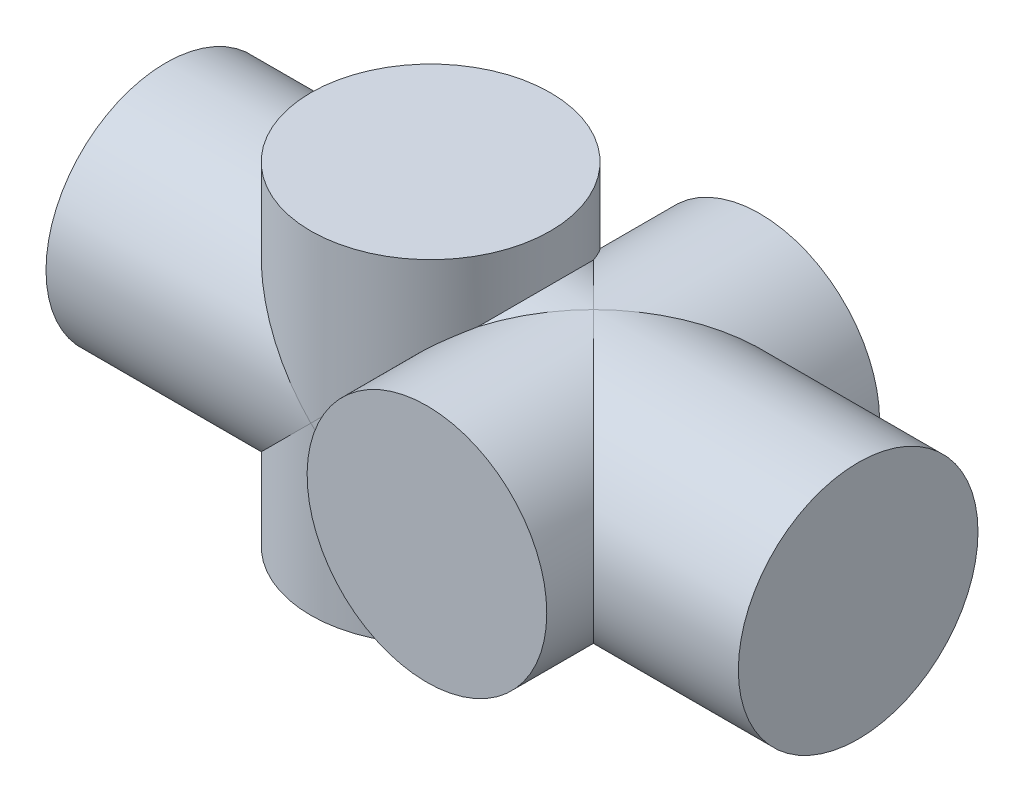
ISO-10303-21;
HEADER;
FILE_DESCRIPTION(('STEP AP214'),'2;1');
FILE_NAME('part.step','',(''),(''),'','','');
FILE_SCHEMA(('AUTOMOTIVE_DESIGN { 1 0 10303 214 1 1 1 1 }'));
ENDSEC;
DATA;
#1=APPLICATION_CONTEXT('core data for automotive mechanical design processes');
#2=APPLICATION_PROTOCOL_DEFINITION('international standard','automotive_design',2000,#1);
#3=PRODUCT_CONTEXT('',#1,'mechanical');
#4=PRODUCT('Part','Part','',(#3));
#5=PRODUCT_RELATED_PRODUCT_CATEGORY('part','',(#4));
#6=PRODUCT_DEFINITION_FORMATION('','',#4);
#7=PRODUCT_DEFINITION_CONTEXT('part definition',#1,'design');
#8=PRODUCT_DEFINITION('design','',#6,#7);
#9=PRODUCT_DEFINITION_SHAPE('','',#8);
#10=(LENGTH_UNIT() NAMED_UNIT(*) SI_UNIT(.MILLI.,.METRE.));
#11=(NAMED_UNIT(*) PLANE_ANGLE_UNIT() SI_UNIT($,.RADIAN.));
#12=(NAMED_UNIT(*) SI_UNIT($,.STERADIAN.) SOLID_ANGLE_UNIT());
#13=UNCERTAINTY_MEASURE_WITH_UNIT(LENGTH_MEASURE(1.E-05),#10,'distance_accuracy_value','');
#14=(GEOMETRIC_REPRESENTATION_CONTEXT(3) GLOBAL_UNCERTAINTY_ASSIGNED_CONTEXT((#13)) GLOBAL_UNIT_ASSIGNED_CONTEXT((#10,
#11,#12)) REPRESENTATION_CONTEXT('',''));
#15=CARTESIAN_POINT('',(0.,0.,0.));
#16=DIRECTION('',(0.,0.,1.));
#17=DIRECTION('',(1.,0.,0.));
#18=AXIS2_PLACEMENT_3D('',#15,#16,#17);
#19=CARTESIAN_POINT('',(-131.5,112.5,0.));
#20=DIRECTION('',(0.,-1.,0.));
#21=DIRECTION('',(0.,0.,-1.));
#22=AXIS2_PLACEMENT_3D('',#19,#20,#21);
#23=CYLINDRICAL_SURFACE('',#22,81.);
#24=CARTESIAN_POINT('',(-131.5,112.5,0.));
#25=DIRECTION('',(0.,1.,0.));
#26=DIRECTION('',(0.,0.,1.));
#27=AXIS2_PLACEMENT_3D('',#24,#25,#26);
#28=CIRCLE('',#27,81.);
#29=CARTESIAN_POINT('',(-131.5,112.5,81.));
#30=VERTEX_POINT('',#29);
#31=EDGE_CURVE('E175',#30,#30,#28,.T.);
#32=ORIENTED_EDGE('',*,*,#31,.F.);
#33=EDGE_LOOP('',(#32));
#34=FACE_BOUND('',#33,.T.);
#35=CARTESIAN_POINT('',(-131.5,0.,0.));
#36=DIRECTION('',(0.707106781186547,-0.707106781186547,0.));
#37=DIRECTION('',(-0.707106781186547,-0.707106781186547,0.));
#38=AXIS2_PLACEMENT_3D('',#35,#36,#37);
#39=ELLIPSE('',#38,114.551298552221,81.);
#40=CARTESIAN_POINT('',(-92.4843673631457,39.0156326368543,-70.9843673631458));
#41=VERTEX_POINT('',#40);
#42=CARTESIAN_POINT('',(-131.5,0.,-81.));
#43=VERTEX_POINT('',#42);
#44=EDGE_CURVE('E191',#41,#43,#39,.F.);
#45=ORIENTED_EDGE('',*,*,#44,.T.);
#46=CARTESIAN_POINT('',(-131.5,0.,0.));
#47=DIRECTION('',(-0.707106781186547,-0.707106781186547,0.));
#48=DIRECTION('',(0.707106781186547,-0.707106781186547,0.));
#49=AXIS2_PLACEMENT_3D('',#46,#47,#48);
#50=ELLIPSE('',#49,114.551298552221,81.);
#51=CARTESIAN_POINT('',(-131.5,0.,81.));
#52=VERTEX_POINT('',#51);
#53=EDGE_CURVE('E185',#43,#52,#50,.F.);
#54=ORIENTED_EDGE('',*,*,#53,.T.);
#55=CARTESIAN_POINT('',(-92.4843673631456,39.0156326368544,70.9843673631457));
#56=VERTEX_POINT('',#55);
#57=EDGE_CURVE('E63',#52,#56,#39,.F.);
#58=ORIENTED_EDGE('',*,*,#57,.T.);
#59=CARTESIAN_POINT('',(-102.5,0.,75.6306816047561));
#60=CARTESIAN_POINT('',(-102.499999696785,-1.02651249092197,75.6306818980094));
#61=CARTESIAN_POINT('',(-102.480482468346,-2.05303603876462,75.6232065312669));
#62=CARTESIAN_POINT('',(-102.402456997545,-4.10439117424408,75.5932187500969));
#63=CARTESIAN_POINT('',(-102.343948140469,-5.12922273495084,75.5707060986021));
#64=CARTESIAN_POINT('',(-102.188069727472,-7.17554071316511,75.5103816173126));
#65=CARTESIAN_POINT('',(-102.090697788913,-8.197026921702,75.4725688494882));
#66=CARTESIAN_POINT('',(-101.857322606304,-10.2348674698346,75.3812136843162));
#67=CARTESIAN_POINT('',(-101.721319519436,-11.2512218302937,75.3276713509688));
#68=CARTESIAN_POINT('',(-101.410952551921,-13.2774438774182,75.2042360728879));
#69=CARTESIAN_POINT('',(-101.236574594541,-14.2873090434369,75.134337127598));
#70=CARTESIAN_POINT('',(-100.849920620821,-16.2984235796766,74.9774376765525));
#71=CARTESIAN_POINT('',(-100.637644566289,-17.2996729412136,74.8904371535622));
#72=CARTESIAN_POINT('',(-100.17574668281,-19.2917678948949,74.6984183540577));
#73=CARTESIAN_POINT('',(-99.9261252935789,-20.2826136093879,74.5934002896854));
#74=CARTESIAN_POINT('',(-99.3902113681338,-22.2521121175052,74.3642817002539));
#75=CARTESIAN_POINT('',(-99.1039188274995,-23.2307649096597,74.2401811728946));
#76=CARTESIAN_POINT('',(-98.4946198723409,-25.1767948310647,73.971319260287));
#77=CARTESIAN_POINT('',(-98.1715120245247,-26.1441322956402,73.8265004977237));
#78=CARTESIAN_POINT('',(-97.4902208033794,-28.0628352452722,73.5151357571378));
#79=CARTESIAN_POINT('',(-97.1320374058587,-29.0142007193123,73.3485897641298));
#80=CARTESIAN_POINT('',(-96.3817434135551,-30.8990848144741,72.9923318678649));
#81=CARTESIAN_POINT('',(-95.9896319902784,-31.8326029991001,72.8026193988555));
#82=CARTESIAN_POINT('',(-95.1728416227614,-33.6798493505506,72.3985162806009));
#83=CARTESIAN_POINT('',(-94.7481627251849,-34.5935775457286,72.1841256667151));
#84=CARTESIAN_POINT('',(-93.8680597872073,-36.3987864210386,71.7292289838563));
#85=CARTESIAN_POINT('',(-93.4126539154994,-37.2902798286505,71.4887382973988));
#86=CARTESIAN_POINT('',(-92.4726661885438,-39.0496527018732,70.9799464882254));
#87=CARTESIAN_POINT('',(-91.9880842532381,-39.9175321026784,70.7116452891971));
#88=CARTESIAN_POINT('',(-90.9918122721425,-41.6277226258935,70.1456691815644));
#89=CARTESIAN_POINT('',(-90.4801237071992,-42.4700351410868,69.8479958768058));
#90=CARTESIAN_POINT('',(-89.431913558972,-44.1272745840299,69.2217364474735));
#91=CARTESIAN_POINT('',(-88.8953923069081,-44.9422018767954,68.8931507351514));
#92=CARTESIAN_POINT('',(-87.8276506996059,-46.5025910136248,68.2209906080732));
#93=CARTESIAN_POINT('',(-87.2975230513287,-47.2494846420378,67.8790033467085));
#94=CARTESIAN_POINT('',(-86.2195919425869,-48.7155230100524,67.1647424951134));
#95=CARTESIAN_POINT('',(-85.6717886693281,-49.4346680433675,66.792469225584));
#96=CARTESIAN_POINT('',(-84.5611269957467,-50.8438698967652,66.0166722692669));
#97=CARTESIAN_POINT('',(-83.9982689081717,-51.5339273203461,65.6131492313301));
#98=CARTESIAN_POINT('',(-82.8602837591952,-52.8837863643804,64.7740514625634));
#99=CARTESIAN_POINT('',(-82.2851566908547,-53.5435879677213,64.3384767136053));
#100=CARTESIAN_POINT('',(-81.1259769238645,-54.8314963548812,63.4349856812652));
#101=CARTESIAN_POINT('',(-80.5419303798208,-55.4596238117663,62.9670909777734));
#102=CARTESIAN_POINT('',(-79.3676183867358,-56.6838441531627,61.9983397000222));
#103=CARTESIAN_POINT('',(-78.7773529091204,-57.2799368904072,61.4974829742567));
#104=CARTESIAN_POINT('',(-77.593815661564,-58.4394570628812,60.4627249134944));
#105=CARTESIAN_POINT('',(-77.0005440898342,-59.0028866220958,59.9288257318243));
#106=CARTESIAN_POINT('',(-75.8141767781288,-60.0967652694794,58.828086751621));
#107=CARTESIAN_POINT('',(-75.2210810345763,-60.6272150819827,58.261247677076));
#108=CARTESIAN_POINT('',(-74.0952438342061,-61.6055331570985,57.1511796992874));
#109=CARTESIAN_POINT('',(-73.5621910198054,-62.0564345871083,56.6109347382194));
#110=CARTESIAN_POINT('',(-72.5011765337514,-62.9313338885521,55.5042916678667));
#111=CARTESIAN_POINT('',(-71.9732148460277,-63.3553318449312,54.9378936411676));
#112=CARTESIAN_POINT('',(-70.924703410765,-64.1766481764497,53.7795840751253));
#113=CARTESIAN_POINT('',(-70.4041530865649,-64.5739686363418,53.1876745353664));
#114=CARTESIAN_POINT('',(-69.3726104205713,-65.3423815474801,51.9790216579819));
#115=CARTESIAN_POINT('',(-68.861618134206,-65.7134738466607,51.3622781764063));
#116=CARTESIAN_POINT('',(-67.8511942517921,-66.4300420545227,50.1046930239155));
#117=CARTESIAN_POINT('',(-67.3517647326984,-66.7755133852345,49.4638470770408));
#118=CARTESIAN_POINT('',(-66.3664880179111,-67.4414699584751,48.1590489471537));
#119=CARTESIAN_POINT('',(-65.8806420203021,-67.7619530014354,47.4950947374835));
#120=CARTESIAN_POINT('',(-64.9244472923161,-68.3786592020229,46.1452042174617));
#121=CARTESIAN_POINT('',(-64.4540976124037,-68.67488384774,45.4592692590783));
#122=CARTESIAN_POINT('',(-63.5305227745717,-69.2439846862287,44.0664101181739));
#123=CARTESIAN_POINT('',(-63.0772991967075,-69.5168587275945,43.3594840097003));
#124=CARTESIAN_POINT('',(-62.1856073238472,-70.0424986524759,41.9194297780638));
#125=CARTESIAN_POINT('',(-61.7473074160848,-70.2950626848286,41.1861237597273));
#126=CARTESIAN_POINT('',(-60.8911902591343,-70.7783568102733,39.7005170726045));
#127=CARTESIAN_POINT('',(-60.4733748596574,-71.0090849333689,38.9482146977426));
#128=CARTESIAN_POINT('',(-59.6596203680497,-71.4496847066751,37.4259887180687));
#129=CARTESIAN_POINT('',(-59.2636791140451,-71.6595584196199,36.6560668653066));
#130=CARTESIAN_POINT('',(-58.4947707002254,-72.0595223642898,35.0997140840543));
#131=CARTESIAN_POINT('',(-58.1218053769475,-72.249611015369,34.3132818425568));
#132=CARTESIAN_POINT('',(-57.3998617995223,-72.6110385412077,32.7250754435455));
#133=CARTESIAN_POINT('',(-57.0508878118345,-72.7823740842304,31.9232985894902));
#134=CARTESIAN_POINT('',(-56.3778889339796,-73.1072671042087,30.3057073020996));
#135=CARTESIAN_POINT('',(-56.0538663996355,-73.2608229031549,29.4898915521394));
#136=CARTESIAN_POINT('',(-55.4316161974454,-73.5510930759802,27.845533938232));
#137=CARTESIAN_POINT('',(-55.1333884100315,-73.6878075279263,27.0169921332957));
#138=CARTESIAN_POINT('',(-54.5634278986493,-73.9453008667947,25.3483959594753));
#139=CARTESIAN_POINT('',(-54.2916955150644,-74.0660795489989,24.508341442847));
#140=CARTESIAN_POINT('',(-53.7498192252839,-74.3037359301135,22.7343877979392));
#141=CARTESIAN_POINT('',(-53.4824862457982,-74.4190484917617,21.7994189032543));
#142=CARTESIAN_POINT('',(-52.981238489759,-74.6324716034373,19.9186170804299));
#143=CARTESIAN_POINT('',(-52.7473242441951,-74.7305818801435,18.9727839799272));
#144=CARTESIAN_POINT('',(-52.3134808318338,-74.9105103150816,17.0717815851057));
#145=CARTESIAN_POINT('',(-52.113553022316,-74.9923278226689,16.1166119195328));
#146=CARTESIAN_POINT('',(-51.7481626498739,-75.1404519605577,14.1985074304101));
#147=CARTESIAN_POINT('',(-51.5827002695041,-75.2067585087018,13.2355725657581));
#148=CARTESIAN_POINT('',(-51.2865648993686,-75.324537533496,11.3031267184256));
#149=CARTESIAN_POINT('',(-51.1559039474496,-75.3760048777582,10.3336135789197));
#150=CARTESIAN_POINT('',(-50.9297337071062,-75.4645978224251,8.38984739813074));
#151=CARTESIAN_POINT('',(-50.8342243532452,-75.5017234495277,7.41559436567462));
#152=CARTESIAN_POINT('',(-50.6785596768277,-75.5620184114897,5.46381083343742));
#153=CARTESIAN_POINT('',(-50.6184053143102,-75.5851873673662,4.48628024538152));
#154=CARTESIAN_POINT('',(-50.5335812484305,-75.6178101518882,2.52945538339216));
#155=CARTESIAN_POINT('',(-50.5089116026213,-75.627263958289,1.55016110660073));
#156=CARTESIAN_POINT('',(-50.4946132896076,-75.6327476354153,-0.479175573740624));
#157=CARTESIAN_POINT('',(-50.5076325292551,-75.6277630971369,-1.52924051230695));
#158=CARTESIAN_POINT('',(-50.5744746053025,-75.6020912002519,-3.62788756597481));
#159=CARTESIAN_POINT('',(-50.6282979464475,-75.5814036473995,-4.6764696625729));
#160=CARTESIAN_POINT('',(-50.7766222726352,-75.5240737325437,-6.77037228625007));
#161=CARTESIAN_POINT('',(-50.871125347105,-75.4874305510126,-7.81569264301868));
#162=CARTESIAN_POINT('',(-51.1005773452327,-75.3977518943373,-9.90117689409717));
#163=CARTESIAN_POINT('',(-51.235526140797,-75.3447164711081,-10.9413408047272));
#164=CARTESIAN_POINT('',(-51.5455779864131,-75.2216130628653,-13.0149820642302));
#165=CARTESIAN_POINT('',(-51.7206933066151,-75.1515398727271,-14.0484572704255));
#166=CARTESIAN_POINT('',(-52.1106008803789,-74.9935687640029,-16.1065272232333));
#167=CARTESIAN_POINT('',(-52.3253931626947,-74.9056708324994,-17.1311219634095));
#168=CARTESIAN_POINT('',(-52.7940724566501,-74.7110795372037,-19.169523536128));
#169=CARTESIAN_POINT('',(-53.0479591137398,-74.6043863438659,-20.1833304664167));
#170=CARTESIAN_POINT('',(-53.5941102980155,-74.3710713697773,-22.1982403180846));
#171=CARTESIAN_POINT('',(-53.8863748372953,-74.2444495827465,-23.1993432354604));
#172=CARTESIAN_POINT('',(-54.5095003985977,-73.9695156955307,-25.1903728114787));
#173=CARTESIAN_POINT('',(-54.8404930831391,-73.8211291421029,-26.1802480125368));
#174=CARTESIAN_POINT('',(-55.5391945241107,-73.5015700523862,-28.1432298321242));
#175=CARTESIAN_POINT('',(-55.9069033145582,-73.330397494986,-29.1163364351165));
#176=CARTESIAN_POINT('',(-56.6778016365654,-72.9637200797935,-31.0437750622005));
#177=CARTESIAN_POINT('',(-57.0809922489638,-72.7682144806985,-31.9981065132838));
#178=CARTESIAN_POINT('',(-57.9213829155271,-72.3512465528694,-33.8859055309752));
#179=CARTESIAN_POINT('',(-58.3585829022303,-72.1297842756231,-34.8193731389646));
#180=CARTESIAN_POINT('',(-59.264974704593,-71.6593830850097,-36.6627225050849));
#181=CARTESIAN_POINT('',(-59.7341435741344,-71.4104638015161,-37.5726205464759));
#182=CARTESIAN_POINT('',(-60.7028049768336,-70.8833132905135,-39.3674623852477));
#183=CARTESIAN_POINT('',(-61.202297641984,-70.6050819354119,-40.2524060739834));
#184=CARTESIAN_POINT('',(-62.2293435627601,-70.0176441550678,-41.9952274676966));
#185=CARTESIAN_POINT('',(-62.7568945634566,-69.7084402172013,-42.8531073388769));
#186=CARTESIAN_POINT('',(-63.8375868786749,-69.0574153540745,-44.5398815501744));
#187=CARTESIAN_POINT('',(-64.3907276811128,-68.7155950813626,-45.3687764697345));
#188=CARTESIAN_POINT('',(-65.4786264481031,-68.0240030529499,-46.9363497771932));
#189=CARTESIAN_POINT('',(-66.0117829563977,-67.6766293413444,-47.6771989037167));
#190=CARTESIAN_POINT('',(-67.0952456178144,-66.9514635721666,-49.130941116537));
#191=CARTESIAN_POINT('',(-67.6455515022954,-66.5736719909368,-49.8438346403577));
#192=CARTESIAN_POINT('',(-68.7606562790235,-65.7867463691742,-51.2403469695462));
#193=CARTESIAN_POINT('',(-69.325454643915,-65.3776134680234,-51.9239668377211));
#194=CARTESIAN_POINT('',(-70.466744015904,-64.5272373982978,-53.2608119514133));
#195=CARTESIAN_POINT('',(-71.0432350451923,-64.0859941687785,-53.9140371392385));
#196=CARTESIAN_POINT('',(-72.2045366909791,-63.1711638311871,-55.1886843033277));
#197=CARTESIAN_POINT('',(-72.7893413818674,-62.6975989272128,-55.81012760957));
#198=CARTESIAN_POINT('',(-73.9645660389313,-61.7175396006933,-57.0209229043239));
#199=CARTESIAN_POINT('',(-74.554986029058,-61.2110450376382,-57.6102747558822));
#200=CARTESIAN_POINT('',(-75.7382307819224,-60.1650878153904,-58.7563055976803));
#201=CARTESIAN_POINT('',(-76.3310553984062,-59.6256271339986,-59.3129865440891));
#202=CARTESIAN_POINT('',(-77.5159319901644,-58.5138894846307,-60.3934035854787));
#203=CARTESIAN_POINT('',(-78.1079839819951,-57.9416132320639,-60.9171403981501));
#204=CARTESIAN_POINT('',(-79.2311289926648,-56.8215067421121,-61.8826258125064));
#205=CARTESIAN_POINT('',(-79.7625875110947,-56.2766526196632,-62.3274077798435));
#206=CARTESIAN_POINT('',(-80.8199611243584,-55.1609723388467,-63.1901832422744));
#207=CARTESIAN_POINT('',(-81.3458762351517,-54.5901462552779,-63.6081768145099));
#208=CARTESIAN_POINT('',(-82.3898657231055,-53.4231890965572,-64.4176294732548));
#209=CARTESIAN_POINT('',(-82.9079407251466,-52.827060052692,-64.8090906832185));
#210=CARTESIAN_POINT('',(-83.9341332540467,-51.6101972481972,-65.5659577861062));
#211=CARTESIAN_POINT('',(-84.4422507226088,-50.9894633435813,-65.9313635265201));
#212=CARTESIAN_POINT('',(-85.4465635155765,-49.7241346521809,-66.6367589088936));
#213=CARTESIAN_POINT('',(-85.94275652431,-49.0795352916104,-66.9767436408531));
#214=CARTESIAN_POINT('',(-86.9212242857218,-47.7674909310755,-67.6319412371838));
#215=CARTESIAN_POINT('',(-87.4034978199064,-47.1000439421701,-67.947151937003));
#216=CARTESIAN_POINT('',(-88.3522480184002,-45.7434369648334,-68.5535444571402));
#217=CARTESIAN_POINT('',(-88.8187256146303,-45.0542782619858,-68.8447276964797));
#218=CARTESIAN_POINT('',(-89.7342892878138,-43.6552485706271,-69.4039855269763));
#219=CARTESIAN_POINT('',(-90.183373762978,-42.945375684985,-69.6720579925608));
#220=CARTESIAN_POINT('',(-91.0679280894477,-41.4973720262203,-70.1891245776664));
#221=CARTESIAN_POINT('',(-91.5031659811448,-40.7590026022327,-70.4378470640957));
#222=CARTESIAN_POINT('',(-92.3528185099446,-39.2634419559046,-70.9135760243567));
#223=CARTESIAN_POINT('',(-92.7672312634053,-38.5062490401971,-71.1405805354611));
#224=CARTESIAN_POINT('',(-93.5738658972557,-36.9744098387789,-71.5738637776939));
#225=CARTESIAN_POINT('',(-93.9660899268166,-36.1997652536118,-71.7801445176069));
#226=CARTESIAN_POINT('',(-94.7272522334155,-34.6341958825581,-72.1730444038818));
#227=CARTESIAN_POINT('',(-95.0961886518569,-33.8432698039004,-72.3596619817097));
#228=CARTESIAN_POINT('',(-96.1666029867914,-31.4476768070967,-72.8916129316503));
#229=CARTESIAN_POINT('',(-96.8316490809798,-29.8202650587775,-73.2090249901574));
#230=CARTESIAN_POINT('',(-98.0574682065155,-26.5153014130878,-73.7770548139781));
#231=CARTESIAN_POINT('',(-98.6182353913028,-24.8377467104911,-74.0276688344964));
#232=CARTESIAN_POINT('',(-99.4024946700563,-22.2069948235853,-74.3696274356743));
#233=CARTESIAN_POINT('',(-99.6641754962411,-21.2676809106178,-74.4818821639001));
#234=CARTESIAN_POINT('',(-100.153862826066,-19.3783872477454,-74.6892937333409));
#235=CARTESIAN_POINT('',(-100.381868791266,-18.4284073275591,-74.7844503011723));
#236=CARTESIAN_POINT('',(-100.803630907512,-16.5193777962654,-74.9585547193236));
#237=CARTESIAN_POINT('',(-100.997385663887,-15.5603278175102,-75.0375019096375));
#238=CARTESIAN_POINT('',(-101.350187728071,-13.6347206341405,-75.17995095972));
#239=CARTESIAN_POINT('',(-101.509234855765,-12.6681633905945,-75.2434527393359));
#240=CARTESIAN_POINT('',(-101.792308931756,-10.7287393844217,-75.3556652057852));
#241=CARTESIAN_POINT('',(-101.916323691543,-9.75587054598836,-75.4043707451341));
#242=CARTESIAN_POINT('',(-102.12898765238,-7.80566965237183,-75.4874603308562));
#243=CARTESIAN_POINT('',(-102.217636917291,-6.82833760525132,-75.5218444030903));
#244=CARTESIAN_POINT('',(-102.359381664808,-4.87068227338653,-75.5766507656101));
#245=CARTESIAN_POINT('',(-102.412476205117,-3.89035891005575,-75.5970726858604));
#246=CARTESIAN_POINT('',(-102.48299582985,-1.92824354887082,-75.6241686460428));
#247=CARTESIAN_POINT('',(-102.500420865035,-0.946451548991167,-75.6308426669966));
#248=CARTESIAN_POINT('',(-102.499533556418,1.08622263504153,-75.6305030879559));
#249=CARTESIAN_POINT('',(-102.478619918249,2.13710462069567,-75.6224931766545));
#250=CARTESIAN_POINT('',(-102.395931539903,4.2370298478073,-75.5907080718105));
#251=CARTESIAN_POINT('',(-102.334156303681,5.2860730667878,-75.5669326868803));
#252=CARTESIAN_POINT('',(-102.169890183302,7.38053533218638,-75.5033272010964));
#253=CARTESIAN_POINT('',(-102.067397218326,8.42595419063238,-75.4634962797471));
#254=CARTESIAN_POINT('',(-101.821948949311,10.5112655036641,-75.367304962939));
#255=CARTESIAN_POINT('',(-101.678993771985,11.5511579755461,-75.3109446192446));
#256=CARTESIAN_POINT('',(-101.352934580101,13.6238675061482,-75.1810165708209));
#257=CARTESIAN_POINT('',(-101.169818685892,14.6566823778758,-75.1074437741698));
#258=CARTESIAN_POINT('',(-100.763942064675,16.7130433729394,-74.9422627364769));
#259=CARTESIAN_POINT('',(-100.541181306029,17.736589488878,-74.8506544810425));
#260=CARTESIAN_POINT('',(-100.0566253585,19.77249387148,-74.6483965759783));
#261=CARTESIAN_POINT('',(-99.7948305647981,20.7848522512971,-74.5377471191206));
#262=CARTESIAN_POINT('',(-99.2329543689103,22.7964548502618,-74.2962399252116));
#263=CARTESIAN_POINT('',(-98.9328729686562,23.795699070071,-74.16538218918));
#264=CARTESIAN_POINT('',(-98.2947686748046,25.7808534159222,-73.8818970042251));
#265=CARTESIAN_POINT('',(-97.9566798979775,26.7667369623738,-73.7292316253083));
#266=CARTESIAN_POINT('',(-97.2440782298514,28.7213628907844,-73.4008563973646));
#267=CARTESIAN_POINT('',(-96.8695653169099,29.6901052625581,-73.2251465346452));
#268=CARTESIAN_POINT('',(-96.0853882472949,31.6084420413309,-72.8491204323139));
#269=CARTESIAN_POINT('',(-95.6757230561797,32.5580358838214,-72.6488034685029));
#270=CARTESIAN_POINT('',(-94.8227534576231,34.4359894177473,-72.2219288834181));
#271=CARTESIAN_POINT('',(-94.3794491159714,35.3643491507068,-71.9953713134639));
#272=CARTESIAN_POINT('',(-93.4612806817627,37.1970937254172,-71.5145032695896));
#273=CARTESIAN_POINT('',(-92.9864401796782,38.1014957956601,-71.2602134512171));
#274=CARTESIAN_POINT('',(-92.0068977151345,39.8849901713924,-70.7220413104566));
#275=CARTESIAN_POINT('',(-91.5021956201366,40.7640823645197,-70.4381588567193));
#276=CARTESIAN_POINT('',(-90.465243054001,42.4948570255399,-69.839152227353));
#277=CARTESIAN_POINT('',(-89.9329948488405,43.3465417386882,-69.5240306195495));
#278=CARTESIAN_POINT('',(-88.843468298905,45.020601788144,-68.8609246324734));
#279=CARTESIAN_POINT('',(-88.2861904681718,45.842977725754,-68.5129409279389));
#280=CARTESIAN_POINT('',(-87.1919372176499,47.396236728678,-67.8099273692019));
#281=CARTESIAN_POINT('',(-86.6565577749914,48.1293639302149,-67.4573683681797));
#282=CARTESIAN_POINT('',(-85.5692678462494,49.5675448873633,-66.7218001560649));
#283=CARTESIAN_POINT('',(-85.0173576262145,50.2725990943604,-66.3387914348702));
#284=CARTESIAN_POINT('',(-83.8996795137978,51.6533532334829,-65.5414424898126));
#285=CARTESIAN_POINT('',(-83.3339121483013,52.3290542789915,-65.1271034559643));
#286=CARTESIAN_POINT('',(-82.1913282563703,53.6500260330118,-64.2663710388339));
#287=CARTESIAN_POINT('',(-81.6145117070713,54.2952966785434,-63.8199775892153));
#288=CARTESIAN_POINT('',(-80.4531861986835,55.5540697998994,-62.8949402153935));
#289=CARTESIAN_POINT('',(-79.8686824799678,56.1675926399574,-62.4163174293849));
#290=CARTESIAN_POINT('',(-78.6946963552961,57.3626036611956,-61.426293006988));
#291=CARTESIAN_POINT('',(-78.1052139286658,57.9440917092744,-60.9148912344253));
#292=CARTESIAN_POINT('',(-76.9244628947235,59.0745030132976,-59.8593167453503));
#293=CARTESIAN_POINT('',(-76.3331943916232,59.6234281320343,-59.3151459070181));
#294=CARTESIAN_POINT('',(-75.1520246957716,60.6884883166824,-58.1942309018935));
#295=CARTESIAN_POINT('',(-74.5621234741971,61.204624079989,-57.6174874283801));
#296=CARTESIAN_POINT('',(-73.4428646355552,62.1564632213881,-56.488400039848));
#297=CARTESIAN_POINT('',(-72.913095178843,62.5951440656717,-55.9389695915384));
#298=CARTESIAN_POINT('',(-71.8595468970373,63.4458386538378,-54.8143230831458));
#299=CARTESIAN_POINT('',(-71.3357680574142,63.8578524624102,-54.23910708562));
#300=CARTESIAN_POINT('',(-70.2964729209883,64.6554971935171,-53.0635819305947));
#301=CARTESIAN_POINT('',(-69.7809559672218,65.0411302218335,-52.4632747821123));
#302=CARTESIAN_POINT('',(-68.7602726649116,65.7865183524034,-51.2382885118003));
#303=CARTESIAN_POINT('',(-68.2551063764958,66.1462733043596,-50.6136092484524));
#304=CARTESIAN_POINT('',(-67.2570552205345,66.8405679870533,-49.340635580693));
#305=CARTESIAN_POINT('',(-66.7641728040923,67.1751027119318,-48.6923365257648));
#306=CARTESIAN_POINT('',(-65.7926548972935,67.8196179702969,-47.3731557213479));
#307=CARTESIAN_POINT('',(-65.3140206445484,68.1295963746563,-46.7022720208543));
#308=CARTESIAN_POINT('',(-64.3728415437748,68.7257576464565,-45.3390626436163));
#309=CARTESIAN_POINT('',(-63.91029577538,69.0119418763858,-44.6467381977201));
#310=CARTESIAN_POINT('',(-63.0028554561425,69.5614431959415,-43.2416546210936));
#311=CARTESIAN_POINT('',(-62.557962528029,69.8247581859565,-42.5288936220693));
#312=CARTESIAN_POINT('',(-61.680639258648,70.333329845653,-41.0729875480356));
#313=CARTESIAN_POINT('',(-61.2485075091918,70.5782448124676,-40.3295432254618));
#314=CARTESIAN_POINT('',(-60.4054061818847,71.0464771151741,-38.8240030322069));
#315=CARTESIAN_POINT('',(-59.9944385217723,71.2697924954703,-38.0619054805017));
#316=CARTESIAN_POINT('',(-59.1950113121272,71.6958248191477,-36.520436001577));
#317=CARTESIAN_POINT('',(-58.8065496307257,71.8985437148972,-35.74106572021));
#318=CARTESIAN_POINT('',(-58.0532107910826,72.2844503947217,-34.1662327262862));
#319=CARTESIAN_POINT('',(-57.6883355125977,72.4676366228629,-33.3707687377323));
#320=CARTESIAN_POINT('',(-56.6305238312536,72.9894914192132,-30.9618486433494));
#321=CARTESIAN_POINT('',(-55.9744399375698,73.3004359627141,-29.3259382129489));
#322=CARTESIAN_POINT('',(-54.7675220057391,73.8560337969666,-26.0047932769461));
#323=CARTESIAN_POINT('',(-54.2166938287432,74.1006833964098,-24.3195560306086));
#324=CARTESIAN_POINT('',(-53.4483625480634,74.4337936889798,-21.6770948539841));
#325=CARTESIAN_POINT('',(-53.192390979125,74.5430037119395,-20.7334531700606));
#326=CARTESIAN_POINT('',(-52.7143951304083,74.7444246314297,-18.8357539177124));
#327=CARTESIAN_POINT('',(-52.4923713964403,74.8366352546502,-17.8816961820835));
#328=CARTESIAN_POINT('',(-52.0828297095522,75.0049297692521,-15.9647673762634));
#329=CARTESIAN_POINT('',(-51.8953131878083,75.0810129917741,-15.0018959422645));
#330=CARTESIAN_POINT('',(-51.5552278914156,75.2177963289606,-13.0689102108796));
#331=CARTESIAN_POINT('',(-51.4026592943456,75.2784963654595,-12.0987958767165));
#332=CARTESIAN_POINT('',(-51.1327694348156,75.385144656641,-10.1525269377466));
#333=CARTESIAN_POINT('',(-51.0154604890263,75.4310877569108,-9.17637034353648));
#334=CARTESIAN_POINT('',(-50.816418674906,75.5086684176654,-7.21987392674413));
#335=CARTESIAN_POINT('',(-50.7346857443346,75.5403060031777,-6.23953411148349));
#336=CARTESIAN_POINT('',(-50.606969795115,75.5896090663361,-4.27615256484662));
#337=CARTESIAN_POINT('',(-50.5609877005137,75.6072741828379,-3.29311076429153));
#338=CARTESIAN_POINT('',(-50.5048740270738,75.6288184069722,-1.32585686617385));
#339=CARTESIAN_POINT('',(-50.4947424889231,75.6326974989585,-0.34164476728433));
#340=CARTESIAN_POINT('',(-50.5108896034806,75.6265060304354,1.69417792897779));
#341=CARTESIAN_POINT('',(-50.5397214920923,75.6154572736393,2.74576637027087));
#342=CARTESIAN_POINT('',(-50.6382968590086,75.5775259654606,4.84674673304194));
#343=CARTESIAN_POINT('',(-50.7080408243877,75.5506432255683,5.8961386282199));
#344=CARTESIAN_POINT('',(-50.8882751402461,75.4807169463865,7.99093377074715));
#345=CARTESIAN_POINT('',(-50.9987675621135,75.4376725855426,9.03633681259899));
#346=CARTESIAN_POINT('',(-51.2602236447093,75.3349110002995,11.1212446929245));
#347=CARTESIAN_POINT('',(-51.4111871801386,75.2751938275194,12.1607495496488));
#348=CARTESIAN_POINT('',(-51.7532493352979,75.1383713146628,14.2322920646973));
#349=CARTESIAN_POINT('',(-51.9443594011686,75.0612610151844,15.2643275064303));
#350=CARTESIAN_POINT('',(-52.366183669651,74.8887883624711,17.3187395610182));
#351=CARTESIAN_POINT('',(-52.5968979068043,74.7934259933173,18.341116165448));
#352=CARTESIAN_POINT('',(-53.0972912888002,74.5834083590601,20.3742798311924));
#353=CARTESIAN_POINT('',(-53.3669699968275,74.4687533102371,21.3850670222943));
#354=CARTESIAN_POINT('',(-53.9445128589945,74.2189501923916,23.3931154938268));
#355=CARTESIAN_POINT('',(-54.2523769969813,74.083802132038,24.3903767799789));
#356=CARTESIAN_POINT('',(-54.9053518352611,73.7916688418842,26.369406532659));
#357=CARTESIAN_POINT('',(-55.2504629417149,73.634683373952,27.3511748301093));
#358=CARTESIAN_POINT('',(-55.9768067981451,73.2974086408459,29.2971998101471));
#359=CARTESIAN_POINT('',(-56.3580395574407,73.1171193696598,30.2614564882168));
#360=CARTESIAN_POINT('',(-57.1553158731264,72.7316608996961,32.1704511823161));
#361=CARTESIAN_POINT('',(-57.5713604164428,72.5264909954696,33.1151886440216));
#362=CARTESIAN_POINT('',(-58.4367072439398,72.0896286333553,34.9830626335662));
#363=CARTESIAN_POINT('',(-58.886009464067,71.8579362265484,35.9061992030035));
#364=CARTESIAN_POINT('',(-59.8157309966304,71.3665256904725,37.7281154510646));
#365=CARTESIAN_POINT('',(-60.2961261841457,71.1068291876946,38.6269132638745));
#366=CARTESIAN_POINT('',(-61.2863045733812,70.5575685141987,40.3988490516524));
#367=CARTESIAN_POINT('',(-61.7960879079907,70.2680042084176,41.2719869105622));
#368=CARTESIAN_POINT('',(-62.8426797924315,69.6573745059673,42.9905159988004));
#369=CARTESIAN_POINT('',(-63.379486069921,69.3363117558345,43.8359095512865));
#370=CARTESIAN_POINT('',(-64.4775582446846,68.6610868797802,45.4970716405363));
#371=CARTESIAN_POINT('',(-65.0388236270728,68.3069254504359,46.3128408002577));
#372=CARTESIAN_POINT('',(-66.139138799285,67.5924846699141,47.8516751286004));
#373=CARTESIAN_POINT('',(-66.6766015125256,67.2347477845999,48.5770571065936));
#374=CARTESIAN_POINT('',(-67.7674381886108,66.488801387339,49.9996392858027));
#375=CARTESIAN_POINT('',(-68.3208118886626,66.1005923785003,50.6968399520166));
#376=CARTESIAN_POINT('',(-69.4407819701123,65.2928638127354,52.0618172369008));
#377=CARTESIAN_POINT('',(-70.0073778279062,64.8733454942321,52.7295950177177));
#378=CARTESIAN_POINT('',(-71.1509772417973,64.0023206728644,54.0346947082028));
#379=CARTESIAN_POINT('',(-71.7279808212067,63.5508140983431,54.6720165496412));
#380=CARTESIAN_POINT('',(-72.8890534582669,62.6156566635009,55.9149330758774));
#381=CARTESIAN_POINT('',(-73.4731178718622,62.132026081236,56.5205473520761));
#382=CARTESIAN_POINT('',(-74.6455943864115,61.1321468692361,57.6998086568414));
#383=CARTESIAN_POINT('',(-75.2340065049048,60.6158981078503,58.2734555563662));
#384=CARTESIAN_POINT('',(-76.4120057229904,59.5508361699001,59.3883029178657));
#385=CARTESIAN_POINT('',(-77.0015927565632,59.0020247758204,59.9295051526129));
#386=CARTESIAN_POINT('',(-78.1788139912764,57.8720798919545,60.9792840686083));
#387=CARTESIAN_POINT('',(-78.7664482326711,57.2909470728685,61.4878614263824));
#388=CARTESIAN_POINT('',(-79.8816552698269,56.1529699579495,62.4261686215825));
#389=CARTESIAN_POINT('',(-80.4096836012896,55.5989738973888,62.8588170328572));
#390=CARTESIAN_POINT('',(-81.4593081077606,54.465383685235,63.6975702498905));
#391=CARTESIAN_POINT('',(-81.9809042954402,53.8857895840806,64.1036751079467));
#392=CARTESIAN_POINT('',(-83.0154185352408,52.7017200773406,64.8896551905514));
#393=CARTESIAN_POINT('',(-83.5283372709472,52.0972466446793,65.2695324885663));
#394=CARTESIAN_POINT('',(-84.5434369693549,50.8641601463269,66.0035872051374));
#395=CARTESIAN_POINT('',(-85.0456178702055,50.235546941647,66.3577644756876));
#396=CARTESIAN_POINT('',(-86.037359492977,48.9549309774513,67.0411146410868));
#397=CARTESIAN_POINT('',(-86.5269172475984,48.3029228031316,67.3702816915989));
#398=CARTESIAN_POINT('',(-87.4914617547705,46.9765837216061,68.0042769397865));
#399=CARTESIAN_POINT('',(-87.9664472522667,46.3022509020023,68.30910304467));
#400=CARTESIAN_POINT('',(-88.9000393955679,44.9324122067939,68.8951894461409));
#401=CARTESIAN_POINT('',(-89.3586469817489,44.236907551081,69.1764510969886));
#402=CARTESIAN_POINT('',(-90.2579548149534,42.8257372142254,69.7163453471681));
#403=CARTESIAN_POINT('',(-90.6986534131002,42.1100696869169,69.9749758653732));
#404=CARTESIAN_POINT('',(-91.5687241256003,40.6461856849006,70.4751710127612));
#405=CARTESIAN_POINT('',(-91.9977289130747,39.8976105147409,70.7163247103942));
#406=CARTESIAN_POINT('',(-92.8342351039086,38.3819780323356,71.177149947755));
#407=CARTESIAN_POINT('',(-93.241734577621,37.6149190705249,71.3968195612444));
#408=CARTESIAN_POINT('',(-94.0339080190369,36.0637003067736,71.8156858144456));
#409=CARTESIAN_POINT('',(-94.4185839821834,35.2795420080376,72.0148842450561));
#410=CARTESIAN_POINT('',(-95.164051975537,33.6953145394682,72.3938781520443));
#411=CARTESIAN_POINT('',(-95.5248419696582,32.8952440207866,72.5736719751571));
#412=CARTESIAN_POINT('',(-96.5698915753012,30.4729786660831,73.0855015647061));
#413=CARTESIAN_POINT('',(-97.2168840190196,28.8286260483005,73.3900131640147));
#414=CARTESIAN_POINT('',(-98.4046361711259,25.4914584037929,73.9332384243054));
#415=CARTESIAN_POINT('',(-98.9453931238651,23.7986421212705,74.1719503785712));
#416=CARTESIAN_POINT('',(-99.6835153919313,21.1943203073285,74.4901765210416));
#417=CARTESIAN_POINT('',(-99.9213551042608,20.2966717733203,74.5912006425817));
#418=CARTESIAN_POINT('',(-100.366340920651,18.4922529245516,74.7780295559717));
#419=CARTESIAN_POINT('',(-100.573489143993,17.585483244238,74.8638353987412));
#420=CARTESIAN_POINT('',(-100.95665426954,15.7640839090008,75.0209761441842));
#421=CARTESIAN_POINT('',(-101.132668649222,14.8494536234857,75.0923098743685));
#422=CARTESIAN_POINT('',(-101.453169882547,13.0137863195103,75.2211262984788));
#423=CARTESIAN_POINT('',(-101.597659085109,12.0927497836558,75.2786100243926));
#424=CARTESIAN_POINT('',(-101.854871893859,10.2452291468814,75.3802726651197));
#425=CARTESIAN_POINT('',(-101.96758554735,9.31874343173207,75.4244474116083));
#426=CARTESIAN_POINT('',(-102.160957560795,7.46197752569171,75.4998765505373));
#427=CARTESIAN_POINT('',(-102.241618217301,6.53169761147627,75.5311318686426));
#428=CARTESIAN_POINT('',(-102.370746737878,4.66845835194565,75.5810253983195));
#429=CARTESIAN_POINT('',(-102.419210818828,3.73549870469021,75.5996621272019));
#430=CARTESIAN_POINT('',(-102.483836530737,1.86836236831491,75.6244896896798));
#431=CARTESIAN_POINT('',(-102.500000275943,0.934185762857683,75.6306813378786));
#432=CARTESIAN_POINT('',(-102.5,0.,75.6306816047561));
#433=B_SPLINE_CURVE_WITH_KNOTS('',3,(#59,#60,#61,#62,#63,#64,#65,#66,#67,#68,#69,#70,#71,#72,
#73,#74,#75,#76,#77,#78,#79,#80,#81,#82,#83,#84,#85,#86,#87,#88,#89,#90,#91,#92,#93,#94,#95,#96,
#97,#98,#99,#100,#101,#102,#103,#104,#105,#106,#107,#108,#109,#110,#111,#112,#113,#114,#115,
#116,#117,#118,#119,#120,#121,#122,#123,#124,#125,#126,#127,#128,#129,#130,#131,#132,#133,#134,
#135,#136,#137,#138,#139,#140,#141,#142,#143,#144,#145,#146,#147,#148,#149,#150,#151,#152,#153,
#154,#155,#156,#157,#158,#159,#160,#161,#162,#163,#164,#165,#166,#167,#168,#169,#170,#171,#172,
#173,#174,#175,#176,#177,#178,#179,#180,#181,#182,#183,#184,#185,#186,#187,#188,#189,#190,#191,
#192,#193,#194,#195,#196,#197,#198,#199,#200,#201,#202,#203,#204,#205,#206,#207,#208,#209,#210,
#211,#212,#213,#214,#215,#216,#217,#218,#219,#220,#221,#222,#223,#224,#225,#226,#227,#228,#229,
#230,#231,#232,#233,#234,#235,#236,#237,#238,#239,#240,#241,#242,#243,#244,#245,#246,#247,#248,
#249,#250,#251,#252,#253,#254,#255,#256,#257,#258,#259,#260,#261,#262,#263,#264,#265,#266,#267,
#268,#269,#270,#271,#272,#273,#274,#275,#276,#277,#278,#279,#280,#281,#282,#283,#284,#285,#286,
#287,#288,#289,#290,#291,#292,#293,#294,#295,#296,#297,#298,#299,#300,#301,#302,#303,#304,#305,
#306,#307,#308,#309,#310,#311,#312,#313,#314,#315,#316,#317,#318,#319,#320,#321,#322,#323,#324,
#325,#326,#327,#328,#329,#330,#331,#332,#333,#334,#335,#336,#337,#338,#339,#340,#341,#342,#343,
#344,#345,#346,#347,#348,#349,#350,#351,#352,#353,#354,#355,#356,#357,#358,#359,#360,#361,#362,
#363,#364,#365,#366,#367,#368,#369,#370,#371,#372,#373,#374,#375,#376,#377,#378,#379,#380,#381,
#382,#383,#384,#385,#386,#387,#388,#389,#390,#391,#392,#393,#394,#395,#396,#397,#398,#399,#400,
#401,#402,#403,#404,#405,#406,#407,#408,#409,#410,#411,#412,#413,#414,#415,#416,#417,#418,#419,
#420,#421,#422,#423,#424,#425,#426,#427,#428,#429,#430,#431,#432),.UNSPECIFIED.,.T.,.F.,(4,2,2,
2,2,2,2,2,2,2,2,2,2,2,2,2,2,2,2,2,2,2,2,2,2,2,2,2,2,2,2,2,2,2,2,2,2,2,2,2,2,2,2,2,2,2,2,2,2,2,2,
2,2,2,2,2,2,2,2,2,2,2,2,2,2,2,2,2,2,2,2,2,2,2,2,2,2,2,2,2,2,2,2,2,2,2,2,2,2,2,2,2,2,2,2,2,2,2,2,
2,2,2,2,2,2,2,2,2,2,2,2,2,2,2,2,2,2,2,2,2,2,2,2,2,2,2,2,2,2,2,2,2,2,2,2,2,2,2,2,2,2,2,2,2,2,2,2,
2,2,2,2,2,2,2,2,2,2,2,2,2,2,2,2,2,2,2,2,2,2,2,2,2,2,2,2,2,2,2,2,2,2,2,2,2,2,2,4),(0.,
3.07934380869874,6.1587361653539,9.23831734407011,12.3178859927932,15.3985861824988,
18.4792894769077,21.5599565010387,24.6406238965188,27.7299942995254,30.8193668332844,
33.9088148282245,36.9982583965848,40.0858909372912,43.1735319507406,46.2610044586571,
49.3484357975138,52.2804491870009,55.2124315331836,58.1443530177897,61.0762761606576,
64.0062602491622,66.9362578059463,69.8660646198891,72.7958070637222,75.4433840911953,
78.0909527587786,80.7383142867954,83.3856911624399,86.0335399388925,88.6816215270102,
91.3295405512373,93.9777032791691,96.6495697397048,99.3216770218877,101.993519739153,
104.665575748701,107.338105716273,110.010887705544,112.683657304841,115.356461236384,
118.293410021398,121.230405466343,124.167518175377,127.104646441147,130.042789346793,
132.980926782887,135.919143998267,138.857365979155,142.006916782854,145.156506547009,
148.306258102379,151.455999682435,154.606704736343,157.757412073594,160.908090838518,
164.058770596293,167.220491100756,170.382214534569,173.544034313413,176.705847820558,
179.865415322568,183.024996578444,186.184324294758,189.343588816291,192.272444135722,
195.201253598317,198.129956637477,201.058665235374,203.985381757629,206.912110768934,
209.838664363313,212.765154180396,215.409034479346,218.052907164458,220.696568003071,
223.340244314518,225.984429933,228.6288463225,231.273106425248,233.917609470277,
236.594269848762,239.27117189809,241.947814220639,244.624669898025,249.978624937181,
255.332880063744,258.27677096667,261.220708935449,264.16476675037,267.108839842922,
270.053935983326,272.999026805588,275.944195677795,278.889368615662,282.041806277841,
285.194282210228,288.346919265895,291.499546448713,294.65310744822,297.806670964365,
300.960202555895,304.113733988297,307.272818691104,310.431905270989,313.591084846639,
316.750258243887,319.907094489901,323.063944748384,326.220535731932,329.377061917137,
332.297649911515,335.218190926793,338.138621067271,341.059057251736,343.977596328223,
346.896147530042,349.814531612136,352.732853602467,355.373035333488,358.013210659631,
360.653174993686,363.29315465915,365.933656951195,368.574387934908,371.21496760227,
373.855789443983,376.537396645418,379.219246408928,381.900841718672,384.582650479681,
389.946524050332,395.310696220604,398.261482769102,401.212316755107,404.163273098503,
407.114244436092,410.066245392901,413.018241185149,415.970313274689,418.92238871462,
422.077587071623,425.23282299328,428.388219328851,431.543605895396,434.699893315288,
437.856183488019,441.012438279571,444.168691735997,447.324979613372,450.481268305044,
453.637646508953,456.794018633933,459.94797043761,463.101936504179,466.255637797381,
469.409272734401,472.321560294947,475.23379978247,478.145924138914,481.058055019022,
483.968364792781,486.878686313647,489.788848669694,492.698950659627,495.335624109591,
497.97229236447,500.608751933593,503.245226684837,505.882315639309,508.519631082481,
511.15679485378,513.794200880604,516.481060373191,519.168160546114,521.855025440595,
524.542119074497,529.91594715883,535.289914616815,538.091649701805,540.893191233675,
543.694959647879,546.496519232842,549.298955346246,552.101190632933,554.903755126242,
557.706136169308),.UNSPECIFIED.);
#434=CARTESIAN_POINT('',(-60.5156326368541,70.9843673631459,39.0156326368541));
#435=VERTEX_POINT('',#434);
#436=EDGE_CURVE('E135',#435,#56,#433,.T.);
#437=ORIENTED_EDGE('',*,*,#436,.F.);
#438=CARTESIAN_POINT('',(-60.5156326368542,70.9843673631458,-39.0156326368543));
#439=VERTEX_POINT('',#438);
#440=EDGE_CURVE('E193',#435,#439,#39,.F.);
#441=ORIENTED_EDGE('',*,*,#440,.T.);
#442=EDGE_CURVE('E173',#41,#439,#433,.T.);
#443=ORIENTED_EDGE('',*,*,#442,.F.);
#444=EDGE_LOOP('',(#45,#54,#58,#437,#441,#443));
#445=FACE_BOUND('',#444,.T.);
#446=ADVANCED_FACE('F46',(#34,#445),#23,.T.);
#447=CARTESIAN_POINT('',(-21.4999999999999,0.,112.5));
#448=DIRECTION('',(0.,0.,-1.));
#449=DIRECTION('',(-1.,0.,0.));
#450=AXIS2_PLACEMENT_3D('',#447,#448,#449);
#451=CYLINDRICAL_SURFACE('',#450,81.);
#452=CARTESIAN_POINT('',(-21.4999999999999,0.,112.5));
#453=DIRECTION('',(0.,0.,1.));
#454=DIRECTION('',(1.,0.,0.));
#455=AXIS2_PLACEMENT_3D('',#452,#453,#454);
#456=CIRCLE('',#455,81.);
#457=CARTESIAN_POINT('',(59.5000000000001,0.,112.5));
#458=VERTEX_POINT('',#457);
#459=EDGE_CURVE('E178',#458,#458,#456,.T.);
#460=ORIENTED_EDGE('',*,*,#459,.F.);
#461=EDGE_LOOP('',(#460));
#462=FACE_BOUND('',#461,.T.);
#463=ORIENTED_EDGE('',*,*,#436,.T.);
#464=CARTESIAN_POINT('',(-21.4999999999999,0.,0.));
#465=DIRECTION('',(-0.707106781186547,0.,-0.707106781186547));
#466=DIRECTION('',(0.707106781186547,0.,-0.707106781186547));
#467=AXIS2_PLACEMENT_3D('',#464,#465,#466);
#468=ELLIPSE('',#467,114.551298552221,81.);
#469=CARTESIAN_POINT('',(-92.4843673631455,-39.0156326368544,70.9843673631457));
#470=VERTEX_POINT('',#469);
#471=EDGE_CURVE('E12',#56,#470,#468,.F.);
#472=ORIENTED_EDGE('',*,*,#471,.T.);
#473=CARTESIAN_POINT('',(-60.5156326368543,-70.9843673631456,39.0156326368545));
#474=VERTEX_POINT('',#473);
#475=EDGE_CURVE('E119',#470,#474,#433,.T.);
#476=ORIENTED_EDGE('',*,*,#475,.T.);
#477=CARTESIAN_POINT('',(-21.4999999999999,-81.,0.));
#478=VERTEX_POINT('',#477);
#479=EDGE_CURVE('E51',#474,#478,#468,.F.);
#480=ORIENTED_EDGE('',*,*,#479,.T.);
#481=CARTESIAN_POINT('',(-21.4999999999999,0.,0.));
#482=DIRECTION('',(0.707106781186547,0.,-0.707106781186547));
#483=DIRECTION('',(-0.707106781186547,0.,-0.707106781186547));
#484=AXIS2_PLACEMENT_3D('',#481,#482,#483);
#485=ELLIPSE('',#484,114.551298552221,81.);
#486=CARTESIAN_POINT('',(-21.4999999999999,81.,0.));
#487=VERTEX_POINT('',#486);
#488=EDGE_CURVE('E114',#478,#487,#485,.F.);
#489=ORIENTED_EDGE('',*,*,#488,.T.);
#490=EDGE_CURVE('E56',#487,#435,#468,.F.);
#491=ORIENTED_EDGE('',*,*,#490,.T.);
#492=EDGE_LOOP('',(#463,#472,#476,#480,#489,#491));
#493=FACE_BOUND('',#492,.T.);
#494=ADVANCED_FACE('F123',(#462,#493),#451,.T.);
#495=CARTESIAN_POINT('',(-131.5,-112.5,0.));
#496=DIRECTION('',(0.,1.,0.));
#497=DIRECTION('',(0.,0.,1.));
#498=AXIS2_PLACEMENT_3D('',#495,#496,#497);
#499=CIRCLE('',#498,81.);
#500=CARTESIAN_POINT('',(-131.5,-112.5,81.));
#501=VERTEX_POINT('',#500);
#502=EDGE_CURVE('E136',#501,#501,#499,.T.);
#503=ORIENTED_EDGE('',*,*,#502,.T.);
#504=EDGE_LOOP('',(#503));
#505=FACE_BOUND('',#504,.T.);
#506=CARTESIAN_POINT('',(-60.5156326368542,-70.9843673631457,-39.0156326368543));
#507=VERTEX_POINT('',#506);
#508=CARTESIAN_POINT('',(-92.4843673631457,-39.0156326368542,-70.9843673631458));
#509=VERTEX_POINT('',#508);
#510=EDGE_CURVE('E134',#507,#509,#433,.T.);
#511=ORIENTED_EDGE('',*,*,#510,.F.);
#512=CARTESIAN_POINT('',(-131.5,0.,0.));
#513=DIRECTION('',(-0.707106781186547,-0.707106781186547,0.));
#514=DIRECTION('',(0.707106781186547,-0.707106781186547,0.));
#515=AXIS2_PLACEMENT_3D('',#512,#513,#514);
#516=ELLIPSE('',#515,114.551298552221,81.);
#517=EDGE_CURVE('E104',#507,#474,#516,.T.);
#518=ORIENTED_EDGE('',*,*,#517,.T.);
#519=ORIENTED_EDGE('',*,*,#475,.F.);
#520=EDGE_CURVE('E190',#470,#52,#516,.T.);
#521=ORIENTED_EDGE('',*,*,#520,.T.);
#522=CARTESIAN_POINT('',(-131.5,0.,0.));
#523=DIRECTION('',(0.707106781186547,-0.707106781186547,0.));
#524=DIRECTION('',(-0.707106781186547,-0.707106781186547,0.));
#525=AXIS2_PLACEMENT_3D('',#522,#523,#524);
#526=ELLIPSE('',#525,114.551298552221,81.);
#527=EDGE_CURVE('E188',#52,#43,#526,.T.);
#528=ORIENTED_EDGE('',*,*,#527,.T.);
#529=EDGE_CURVE('E172',#43,#509,#516,.T.);
#530=ORIENTED_EDGE('',*,*,#529,.T.);
#531=EDGE_LOOP('',(#511,#518,#519,#521,#528,#530));
#532=FACE_BOUND('',#531,.T.);
#533=ADVANCED_FACE('F48',(#505,#532),#23,.T.);
#534=CARTESIAN_POINT('',(-131.5,112.5,0.));
#535=DIRECTION('',(0.,1.,0.));
#536=DIRECTION('',(0.,0.,1.));
#537=AXIS2_PLACEMENT_3D('',#534,#535,#536);
#538=PLANE('',#537);
#539=ORIENTED_EDGE('',*,*,#31,.T.);
#540=EDGE_LOOP('',(#539));
#541=FACE_BOUND('',#540,.T.);
#542=ADVANCED_FACE('F147',(#541),#538,.T.);
#543=CARTESIAN_POINT('',(-131.5,-112.5,0.));
#544=DIRECTION('',(0.,1.,0.));
#545=DIRECTION('',(0.,0.,1.));
#546=AXIS2_PLACEMENT_3D('',#543,#544,#545);
#547=PLANE('',#546);
#548=ORIENTED_EDGE('',*,*,#502,.F.);
#549=EDGE_LOOP('',(#548));
#550=FACE_BOUND('',#549,.T.);
#551=ADVANCED_FACE('F143',(#550),#547,.F.);
#552=CARTESIAN_POINT('',(-21.4999999999999,0.,-112.5));
#553=DIRECTION('',(0.,0.,1.));
#554=DIRECTION('',(1.,0.,0.));
#555=AXIS2_PLACEMENT_3D('',#552,#553,#554);
#556=CIRCLE('',#555,81.);
#557=CARTESIAN_POINT('',(59.5000000000001,0.,-112.5));
#558=VERTEX_POINT('',#557);
#559=EDGE_CURVE('E180',#558,#558,#556,.T.);
#560=ORIENTED_EDGE('',*,*,#559,.T.);
#561=EDGE_LOOP('',(#560));
#562=FACE_BOUND('',#561,.T.);
#563=CARTESIAN_POINT('',(-21.4999999999999,0.,0.));
#564=DIRECTION('',(0.707106781186547,0.,-0.707106781186547));
#565=DIRECTION('',(-0.707106781186547,0.,-0.707106781186547));
#566=AXIS2_PLACEMENT_3D('',#563,#564,#565);
#567=ELLIPSE('',#566,114.551298552221,81.);
#568=EDGE_CURVE('E110',#439,#487,#567,.T.);
#569=ORIENTED_EDGE('',*,*,#568,.T.);
#570=CARTESIAN_POINT('',(-21.4999999999999,0.,0.));
#571=DIRECTION('',(-0.707106781186547,0.,-0.707106781186547));
#572=DIRECTION('',(0.707106781186547,0.,-0.707106781186547));
#573=AXIS2_PLACEMENT_3D('',#570,#571,#572);
#574=ELLIPSE('',#573,114.551298552221,81.);
#575=EDGE_CURVE('E116',#487,#478,#574,.T.);
#576=ORIENTED_EDGE('',*,*,#575,.T.);
#577=EDGE_CURVE('E99',#478,#507,#567,.T.);
#578=ORIENTED_EDGE('',*,*,#577,.T.);
#579=ORIENTED_EDGE('',*,*,#510,.T.);
#580=EDGE_CURVE('E109',#509,#41,#567,.T.);
#581=ORIENTED_EDGE('',*,*,#580,.T.);
#582=ORIENTED_EDGE('',*,*,#442,.T.);
#583=EDGE_LOOP('',(#569,#576,#578,#579,#581,#582));
#584=FACE_BOUND('',#583,.T.);
#585=ADVANCED_FACE('F125',(#562,#584),#451,.T.);
#586=CARTESIAN_POINT('',(-21.4999999999999,0.,112.5));
#587=DIRECTION('',(0.,0.,1.));
#588=DIRECTION('',(1.,0.,0.));
#589=AXIS2_PLACEMENT_3D('',#586,#587,#588);
#590=PLANE('',#589);
#591=ORIENTED_EDGE('',*,*,#459,.T.);
#592=EDGE_LOOP('',(#591));
#593=FACE_BOUND('',#592,.T.);
#594=ADVANCED_FACE('F142',(#593),#590,.T.);
#595=CARTESIAN_POINT('',(-21.4999999999999,0.,-112.5));
#596=DIRECTION('',(0.,0.,1.));
#597=DIRECTION('',(1.,0.,0.));
#598=AXIS2_PLACEMENT_3D('',#595,#596,#597);
#599=PLANE('',#598);
#600=ORIENTED_EDGE('',*,*,#559,.F.);
#601=EDGE_LOOP('',(#600));
#602=FACE_BOUND('',#601,.T.);
#603=ADVANCED_FACE('F145',(#602),#599,.F.);
#604=CARTESIAN_POINT('',(157.5,0.,0.));
#605=DIRECTION('',(-1.,0.,0.));
#606=DIRECTION('',(0.,0.,1.));
#607=AXIS2_PLACEMENT_3D('',#604,#605,#606);
#608=PLANE('',#607);
#609=CARTESIAN_POINT('',(157.5,0.,0.));
#610=DIRECTION('',(-1.,0.,0.));
#611=DIRECTION('',(0.,0.,1.));
#612=AXIS2_PLACEMENT_3D('',#609,#610,#611);
#613=CIRCLE('',#612,81.);
#614=CARTESIAN_POINT('',(157.5,0.,81.));
#615=VERTEX_POINT('',#614);
#616=EDGE_CURVE('E199',#615,#615,#613,.T.);
#617=ORIENTED_EDGE('',*,*,#616,.F.);
#618=EDGE_LOOP('',(#617));
#619=FACE_BOUND('',#618,.T.);
#620=ADVANCED_FACE('F204',(#619),#608,.F.);
#621=CARTESIAN_POINT('',(157.5,0.,0.));
#622=DIRECTION('',(-1.,0.,0.));
#623=DIRECTION('',(0.,0.,1.));
#624=AXIS2_PLACEMENT_3D('',#621,#622,#623);
#625=CYLINDRICAL_SURFACE('',#624,81.);
#626=ORIENTED_EDGE('',*,*,#616,.T.);
#627=EDGE_LOOP('',(#626));
#628=FACE_BOUND('',#627,.T.);
#629=ORIENTED_EDGE('',*,*,#575,.F.);
#630=ORIENTED_EDGE('',*,*,#488,.F.);
#631=EDGE_LOOP('',(#629,#630));
#632=FACE_BOUND('',#631,.T.);
#633=ADVANCED_FACE('F115',(#628,#632),#625,.T.);
#634=ORIENTED_EDGE('',*,*,#490,.F.);
#635=ORIENTED_EDGE('',*,*,#568,.F.);
#636=ORIENTED_EDGE('',*,*,#440,.F.);
#637=EDGE_LOOP('',(#634,#635,#636));
#638=FACE_BOUND('',#637,.T.);
#639=ADVANCED_FACE('F211',(#638),#625,.T.);
#640=ORIENTED_EDGE('',*,*,#529,.F.);
#641=ORIENTED_EDGE('',*,*,#44,.F.);
#642=ORIENTED_EDGE('',*,*,#580,.F.);
#643=EDGE_LOOP('',(#640,#641,#642));
#644=FACE_BOUND('',#643,.T.);
#645=ADVANCED_FACE('F213',(#644),#625,.T.);
#646=ORIENTED_EDGE('',*,*,#479,.F.);
#647=ORIENTED_EDGE('',*,*,#517,.F.);
#648=ORIENTED_EDGE('',*,*,#577,.F.);
#649=EDGE_LOOP('',(#646,#647,#648));
#650=FACE_BOUND('',#649,.T.);
#651=ADVANCED_FACE('F101',(#650),#625,.T.);
#652=ORIENTED_EDGE('',*,*,#57,.F.);
#653=ORIENTED_EDGE('',*,*,#520,.F.);
#654=ORIENTED_EDGE('',*,*,#471,.F.);
#655=EDGE_LOOP('',(#652,#653,#654));
#656=FACE_BOUND('',#655,.T.);
#657=ADVANCED_FACE('F289',(#656),#625,.T.);
#658=CARTESIAN_POINT('',(-310.5,0.,0.));
#659=DIRECTION('',(-1.,0.,0.));
#660=DIRECTION('',(0.,0.,1.));
#661=AXIS2_PLACEMENT_3D('',#658,#659,#660);
#662=CIRCLE('',#661,81.);
#663=CARTESIAN_POINT('',(-310.5,0.,81.));
#664=VERTEX_POINT('',#663);
#665=EDGE_CURVE('E196',#664,#664,#662,.T.);
#666=ORIENTED_EDGE('',*,*,#665,.F.);
#667=EDGE_LOOP('',(#666));
#668=FACE_BOUND('',#667,.T.);
#669=ORIENTED_EDGE('',*,*,#53,.F.);
#670=ORIENTED_EDGE('',*,*,#527,.F.);
#671=EDGE_LOOP('',(#669,#670));
#672=FACE_BOUND('',#671,.T.);
#673=ADVANCED_FACE('F280',(#668,#672),#625,.T.);
#674=CARTESIAN_POINT('',(-310.5,0.,0.));
#675=DIRECTION('',(-1.,0.,0.));
#676=DIRECTION('',(0.,0.,1.));
#677=AXIS2_PLACEMENT_3D('',#674,#675,#676);
#678=PLANE('',#677);
#679=ORIENTED_EDGE('',*,*,#665,.T.);
#680=EDGE_LOOP('',(#679));
#681=FACE_BOUND('',#680,.T.);
#682=ADVANCED_FACE('F216',(#681),#678,.T.);
#683=CLOSED_SHELL('',(#446,#494,#533,#542,#551,#585,#594,#603,#620,#633,#639,#645,#651,#657,
#673,#682));
#684=MANIFOLD_SOLID_BREP('B2',#683);
#685=ADVANCED_BREP_SHAPE_REPRESENTATION('',(#18,#684),#14);
#686=SHAPE_DEFINITION_REPRESENTATION(#9,#685);
ENDSEC;
END-ISO-10303-21;
